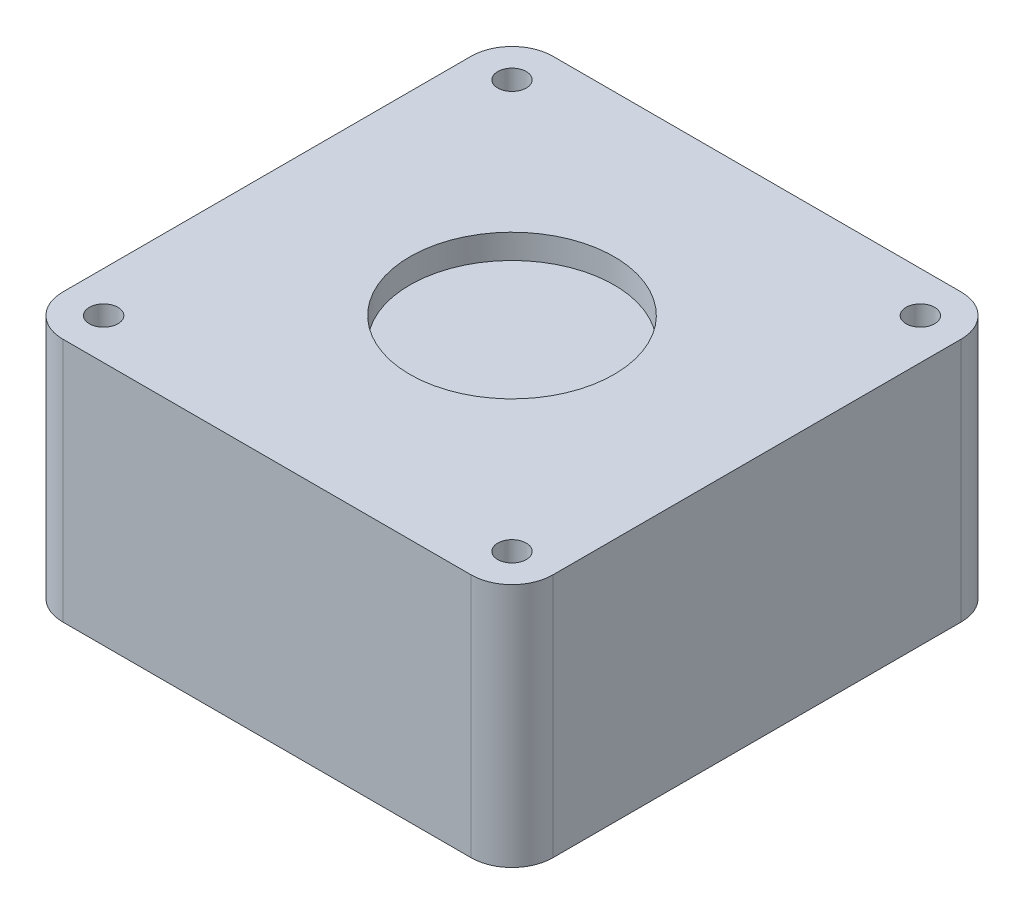
ISO-10303-21;
HEADER;
FILE_DESCRIPTION(('STEP AP214'),'2;1');
FILE_NAME('part.step','',(''),(''),'','','');
FILE_SCHEMA(('AUTOMOTIVE_DESIGN { 1 0 10303 214 1 1 1 1 }'));
ENDSEC;
DATA;
#1=APPLICATION_CONTEXT('core data for automotive mechanical design processes');
#2=APPLICATION_PROTOCOL_DEFINITION('international standard','automotive_design',2000,#1);
#3=PRODUCT_CONTEXT('',#1,'mechanical');
#4=PRODUCT('Part','Part','',(#3));
#5=PRODUCT_RELATED_PRODUCT_CATEGORY('part','',(#4));
#6=PRODUCT_DEFINITION_FORMATION('','',#4);
#7=PRODUCT_DEFINITION_CONTEXT('part definition',#1,'design');
#8=PRODUCT_DEFINITION('design','',#6,#7);
#9=PRODUCT_DEFINITION_SHAPE('','',#8);
#10=(LENGTH_UNIT() NAMED_UNIT(*) SI_UNIT(.MILLI.,.METRE.));
#11=(NAMED_UNIT(*) PLANE_ANGLE_UNIT() SI_UNIT($,.RADIAN.));
#12=(NAMED_UNIT(*) SI_UNIT($,.STERADIAN.) SOLID_ANGLE_UNIT());
#13=UNCERTAINTY_MEASURE_WITH_UNIT(LENGTH_MEASURE(1.E-05),#10,'distance_accuracy_value','');
#14=(GEOMETRIC_REPRESENTATION_CONTEXT(3) GLOBAL_UNCERTAINTY_ASSIGNED_CONTEXT((#13)) GLOBAL_UNIT_ASSIGNED_CONTEXT((#10,
#11,#12)) REPRESENTATION_CONTEXT('',''));
#15=CARTESIAN_POINT('',(0.,0.,0.));
#16=DIRECTION('',(0.,0.,1.));
#17=DIRECTION('',(1.,0.,0.));
#18=AXIS2_PLACEMENT_3D('',#15,#16,#17);
#19=CARTESIAN_POINT('',(30.,30.,30.));
#20=DIRECTION('',(-1.,0.,0.));
#21=DIRECTION('',(0.,0.,1.));
#22=AXIS2_PLACEMENT_3D('',#19,#20,#21);
#23=PLANE('',#22);
#24=DIRECTION('',(0.,0.,-1.));
#25=VECTOR('',#24,1.);
#26=CARTESIAN_POINT('',(30.,0.,30.));
#27=LINE('',#26,#25);
#28=CARTESIAN_POINT('',(30.,0.,25.));
#29=VERTEX_POINT('',#28);
#30=CARTESIAN_POINT('',(30.,0.,-25.));
#31=VERTEX_POINT('',#30);
#32=EDGE_CURVE('E194',#29,#31,#27,.T.);
#33=ORIENTED_EDGE('',*,*,#32,.T.);
#34=DIRECTION('',(0.,-1.,0.));
#35=VECTOR('',#34,1.);
#36=CARTESIAN_POINT('',(30.,30.,-25.));
#37=LINE('',#36,#35);
#38=CARTESIAN_POINT('',(30.,30.,-25.));
#39=VERTEX_POINT('',#38);
#40=EDGE_CURVE('E245',#31,#39,#37,.F.);
#41=ORIENTED_EDGE('',*,*,#40,.T.);
#42=DIRECTION('',(0.,0.,-1.));
#43=VECTOR('',#42,1.);
#44=CARTESIAN_POINT('',(30.,30.,30.));
#45=LINE('',#44,#43);
#46=CARTESIAN_POINT('',(30.,30.,25.));
#47=VERTEX_POINT('',#46);
#48=EDGE_CURVE('E197',#47,#39,#45,.T.);
#49=ORIENTED_EDGE('',*,*,#48,.F.);
#50=DIRECTION('',(0.,-1.,0.));
#51=VECTOR('',#50,1.);
#52=CARTESIAN_POINT('',(30.,30.,25.));
#53=LINE('',#52,#51);
#54=EDGE_CURVE('E242',#47,#29,#53,.T.);
#55=ORIENTED_EDGE('',*,*,#54,.T.);
#56=EDGE_LOOP('',(#33,#41,#49,#55));
#57=FACE_BOUND('',#56,.T.);
#58=ADVANCED_FACE('F35',(#57),#23,.F.);
#59=CARTESIAN_POINT('',(-30.,30.,-30.));
#60=DIRECTION('',(0.,0.,1.));
#61=DIRECTION('',(1.,0.,0.));
#62=AXIS2_PLACEMENT_3D('',#59,#60,#61);
#63=PLANE('',#62);
#64=DIRECTION('',(-1.,0.,0.));
#65=VECTOR('',#64,1.);
#66=CARTESIAN_POINT('',(-30.,0.,-30.));
#67=LINE('',#66,#65);
#68=CARTESIAN_POINT('',(25.,0.,-30.));
#69=VERTEX_POINT('',#68);
#70=CARTESIAN_POINT('',(-25.,0.,-30.));
#71=VERTEX_POINT('',#70);
#72=EDGE_CURVE('E211',#69,#71,#67,.T.);
#73=ORIENTED_EDGE('',*,*,#72,.T.);
#74=DIRECTION('',(0.,-1.,0.));
#75=VECTOR('',#74,1.);
#76=CARTESIAN_POINT('',(-25.,30.,-30.));
#77=LINE('',#76,#75);
#78=CARTESIAN_POINT('',(-25.,30.,-30.));
#79=VERTEX_POINT('',#78);
#80=EDGE_CURVE('E233',#71,#79,#77,.F.);
#81=ORIENTED_EDGE('',*,*,#80,.T.);
#82=DIRECTION('',(-1.,0.,0.));
#83=VECTOR('',#82,1.);
#84=CARTESIAN_POINT('',(-30.,30.,-30.));
#85=LINE('',#84,#83);
#86=CARTESIAN_POINT('',(25.,30.,-30.));
#87=VERTEX_POINT('',#86);
#88=EDGE_CURVE('E200',#87,#79,#85,.T.);
#89=ORIENTED_EDGE('',*,*,#88,.F.);
#90=DIRECTION('',(0.,-1.,0.));
#91=VECTOR('',#90,1.);
#92=CARTESIAN_POINT('',(25.,30.,-30.));
#93=LINE('',#92,#91);
#94=EDGE_CURVE('E230',#87,#69,#93,.T.);
#95=ORIENTED_EDGE('',*,*,#94,.T.);
#96=EDGE_LOOP('',(#73,#81,#89,#95));
#97=FACE_BOUND('',#96,.T.);
#98=ADVANCED_FACE('F270',(#97),#63,.F.);
#99=CARTESIAN_POINT('',(-30.,30.,30.));
#100=DIRECTION('',(1.,0.,0.));
#101=DIRECTION('',(0.,0.,-1.));
#102=AXIS2_PLACEMENT_3D('',#99,#100,#101);
#103=PLANE('',#102);
#104=DIRECTION('',(0.,0.,1.));
#105=VECTOR('',#104,1.);
#106=CARTESIAN_POINT('',(-30.,30.,30.));
#107=LINE('',#106,#105);
#108=CARTESIAN_POINT('',(-30.,30.,-25.));
#109=VERTEX_POINT('',#108);
#110=CARTESIAN_POINT('',(-30.,30.,25.));
#111=VERTEX_POINT('',#110);
#112=EDGE_CURVE('E204',#109,#111,#107,.T.);
#113=ORIENTED_EDGE('',*,*,#112,.F.);
#114=DIRECTION('',(0.,-1.,0.));
#115=VECTOR('',#114,1.);
#116=CARTESIAN_POINT('',(-30.,30.,-25.));
#117=LINE('',#116,#115);
#118=CARTESIAN_POINT('',(-30.,0.,-25.));
#119=VERTEX_POINT('',#118);
#120=EDGE_CURVE('E219',#109,#119,#117,.T.);
#121=ORIENTED_EDGE('',*,*,#120,.T.);
#122=DIRECTION('',(0.,0.,1.));
#123=VECTOR('',#122,1.);
#124=CARTESIAN_POINT('',(-30.,0.,30.));
#125=LINE('',#124,#123);
#126=CARTESIAN_POINT('',(-30.,0.,25.));
#127=VERTEX_POINT('',#126);
#128=EDGE_CURVE('E214',#119,#127,#125,.T.);
#129=ORIENTED_EDGE('',*,*,#128,.T.);
#130=DIRECTION('',(0.,-1.,0.));
#131=VECTOR('',#130,1.);
#132=CARTESIAN_POINT('',(-30.,30.,25.));
#133=LINE('',#132,#131);
#134=EDGE_CURVE('E208',#127,#111,#133,.F.);
#135=ORIENTED_EDGE('',*,*,#134,.T.);
#136=EDGE_LOOP('',(#113,#121,#129,#135));
#137=FACE_BOUND('',#136,.T.);
#138=ADVANCED_FACE('F278',(#137),#103,.F.);
#139=CARTESIAN_POINT('',(-30.,30.,30.));
#140=DIRECTION('',(0.,0.,-1.));
#141=DIRECTION('',(-1.,0.,0.));
#142=AXIS2_PLACEMENT_3D('',#139,#140,#141);
#143=PLANE('',#142);
#144=DIRECTION('',(1.,0.,0.));
#145=VECTOR('',#144,1.);
#146=CARTESIAN_POINT('',(-30.,0.,30.));
#147=LINE('',#146,#145);
#148=CARTESIAN_POINT('',(-25.,0.,30.));
#149=VERTEX_POINT('',#148);
#150=CARTESIAN_POINT('',(25.,0.,30.));
#151=VERTEX_POINT('',#150);
#152=EDGE_CURVE('E201',#149,#151,#147,.T.);
#153=ORIENTED_EDGE('',*,*,#152,.T.);
#154=DIRECTION('',(0.,-1.,0.));
#155=VECTOR('',#154,1.);
#156=CARTESIAN_POINT('',(25.,30.,30.));
#157=LINE('',#156,#155);
#158=CARTESIAN_POINT('',(25.,30.,30.));
#159=VERTEX_POINT('',#158);
#160=EDGE_CURVE('E11',#151,#159,#157,.F.);
#161=ORIENTED_EDGE('',*,*,#160,.T.);
#162=DIRECTION('',(1.,0.,0.));
#163=VECTOR('',#162,1.);
#164=CARTESIAN_POINT('',(-30.,30.,30.));
#165=LINE('',#164,#163);
#166=CARTESIAN_POINT('',(-25.,30.,30.));
#167=VERTEX_POINT('',#166);
#168=EDGE_CURVE('E206',#167,#159,#165,.T.);
#169=ORIENTED_EDGE('',*,*,#168,.F.);
#170=DIRECTION('',(0.,-1.,0.));
#171=VECTOR('',#170,1.);
#172=CARTESIAN_POINT('',(-25.,30.,30.));
#173=LINE('',#172,#171);
#174=EDGE_CURVE('E43',#167,#149,#173,.T.);
#175=ORIENTED_EDGE('',*,*,#174,.T.);
#176=EDGE_LOOP('',(#153,#161,#169,#175));
#177=FACE_BOUND('',#176,.T.);
#178=ADVANCED_FACE('F249',(#177),#143,.F.);
#179=CARTESIAN_POINT('',(0.,30.,0.));
#180=DIRECTION('',(0.,-1.,0.));
#181=DIRECTION('',(0.,0.,-1.));
#182=AXIS2_PLACEMENT_3D('',#179,#180,#181);
#183=PLANE('',#182);
#184=CARTESIAN_POINT('',(0.,30.,0.));
#185=DIRECTION('',(0.,1.,0.));
#186=DIRECTION('',(0.,0.,1.));
#187=AXIS2_PLACEMENT_3D('',#184,#185,#186);
#188=CIRCLE('',#187,12.5);
#189=CARTESIAN_POINT('',(0.,30.,12.5));
#190=VERTEX_POINT('',#189);
#191=EDGE_CURVE('E163',#190,#190,#188,.T.);
#192=ORIENTED_EDGE('',*,*,#191,.F.);
#193=EDGE_LOOP('',(#192));
#194=FACE_BOUND('',#193,.T.);
#195=CARTESIAN_POINT('',(25.,30.,25.));
#196=DIRECTION('',(0.,1.,0.));
#197=DIRECTION('',(0.,0.,1.));
#198=AXIS2_PLACEMENT_3D('',#195,#196,#197);
#199=CIRCLE('',#198,1.75);
#200=CARTESIAN_POINT('',(25.,30.,26.75));
#201=VERTEX_POINT('',#200);
#202=EDGE_CURVE('E170',#201,#201,#199,.T.);
#203=ORIENTED_EDGE('',*,*,#202,.F.);
#204=EDGE_LOOP('',(#203));
#205=FACE_BOUND('',#204,.T.);
#206=CARTESIAN_POINT('',(-25.,30.,25.));
#207=DIRECTION('',(0.,1.,0.));
#208=DIRECTION('',(0.,0.,1.));
#209=AXIS2_PLACEMENT_3D('',#206,#207,#208);
#210=CIRCLE('',#209,1.75);
#211=CARTESIAN_POINT('',(-25.,30.,26.75));
#212=VERTEX_POINT('',#211);
#213=EDGE_CURVE('E176',#212,#212,#210,.T.);
#214=ORIENTED_EDGE('',*,*,#213,.F.);
#215=EDGE_LOOP('',(#214));
#216=FACE_BOUND('',#215,.T.);
#217=CARTESIAN_POINT('',(-25.,30.,-25.));
#218=DIRECTION('',(0.,1.,0.));
#219=DIRECTION('',(0.,0.,1.));
#220=AXIS2_PLACEMENT_3D('',#217,#218,#219);
#221=CIRCLE('',#220,1.75);
#222=CARTESIAN_POINT('',(-25.,30.,-23.25));
#223=VERTEX_POINT('',#222);
#224=EDGE_CURVE('E182',#223,#223,#221,.T.);
#225=ORIENTED_EDGE('',*,*,#224,.F.);
#226=EDGE_LOOP('',(#225));
#227=FACE_BOUND('',#226,.T.);
#228=CARTESIAN_POINT('',(25.,30.,-25.));
#229=DIRECTION('',(0.,1.,0.));
#230=DIRECTION('',(0.,0.,1.));
#231=AXIS2_PLACEMENT_3D('',#228,#229,#230);
#232=CIRCLE('',#231,1.75);
#233=CARTESIAN_POINT('',(25.,30.,-23.25));
#234=VERTEX_POINT('',#233);
#235=EDGE_CURVE('E188',#234,#234,#232,.T.);
#236=ORIENTED_EDGE('',*,*,#235,.F.);
#237=EDGE_LOOP('',(#236));
#238=FACE_BOUND('',#237,.T.);
#239=ORIENTED_EDGE('',*,*,#88,.T.);
#240=CARTESIAN_POINT('',(-25.,30.,-25.));
#241=DIRECTION('',(0.,-1.,0.));
#242=DIRECTION('',(0.,0.,-1.));
#243=AXIS2_PLACEMENT_3D('',#240,#241,#242);
#244=CIRCLE('',#243,5.);
#245=EDGE_CURVE('E240',#79,#109,#244,.F.);
#246=ORIENTED_EDGE('',*,*,#245,.T.);
#247=ORIENTED_EDGE('',*,*,#112,.T.);
#248=CARTESIAN_POINT('',(-25.,30.,25.));
#249=DIRECTION('',(0.,-1.,0.));
#250=DIRECTION('',(0.,0.,-1.));
#251=AXIS2_PLACEMENT_3D('',#248,#249,#250);
#252=CIRCLE('',#251,5.);
#253=EDGE_CURVE('E55',#111,#167,#252,.F.);
#254=ORIENTED_EDGE('',*,*,#253,.T.);
#255=ORIENTED_EDGE('',*,*,#168,.T.);
#256=CARTESIAN_POINT('',(25.,30.,25.));
#257=DIRECTION('',(0.,-1.,0.));
#258=DIRECTION('',(0.,0.,-1.));
#259=AXIS2_PLACEMENT_3D('',#256,#257,#258);
#260=CIRCLE('',#259,5.);
#261=EDGE_CURVE('E236',#159,#47,#260,.F.);
#262=ORIENTED_EDGE('',*,*,#261,.T.);
#263=ORIENTED_EDGE('',*,*,#48,.T.);
#264=CARTESIAN_POINT('',(25.,30.,-25.));
#265=DIRECTION('',(0.,-1.,0.));
#266=DIRECTION('',(0.,0.,-1.));
#267=AXIS2_PLACEMENT_3D('',#264,#265,#266);
#268=CIRCLE('',#267,5.);
#269=EDGE_CURVE('E238',#39,#87,#268,.F.);
#270=ORIENTED_EDGE('',*,*,#269,.T.);
#271=EDGE_LOOP('',(#239,#246,#247,#254,#255,#262,#263,#270));
#272=FACE_BOUND('',#271,.T.);
#273=ADVANCED_FACE('F263',(#194,#205,#216,#227,#238,#272),#183,.F.);
#274=CARTESIAN_POINT('',(0.,0.,0.));
#275=DIRECTION('',(0.,-1.,0.));
#276=DIRECTION('',(0.,0.,-1.));
#277=AXIS2_PLACEMENT_3D('',#274,#275,#276);
#278=PLANE('',#277);
#279=DIRECTION('',(0.,0.,1.));
#280=VECTOR('',#279,1.);
#281=CARTESIAN_POINT('',(10.,0.,-10.));
#282=LINE('',#281,#280);
#283=CARTESIAN_POINT('',(10.,0.,-10.));
#284=VERTEX_POINT('',#283);
#285=CARTESIAN_POINT('',(10.,0.,10.));
#286=VERTEX_POINT('',#285);
#287=EDGE_CURVE('E131',#284,#286,#282,.T.);
#288=ORIENTED_EDGE('',*,*,#287,.F.);
#289=DIRECTION('',(1.,0.,0.));
#290=VECTOR('',#289,1.);
#291=CARTESIAN_POINT('',(-10.,0.,-10.));
#292=LINE('',#291,#290);
#293=CARTESIAN_POINT('',(-10.,0.,-10.));
#294=VERTEX_POINT('',#293);
#295=EDGE_CURVE('E148',#294,#284,#292,.T.);
#296=ORIENTED_EDGE('',*,*,#295,.F.);
#297=DIRECTION('',(0.,0.,-1.));
#298=VECTOR('',#297,1.);
#299=CARTESIAN_POINT('',(-10.,0.,-10.));
#300=LINE('',#299,#298);
#301=CARTESIAN_POINT('',(-10.,0.,10.));
#302=VERTEX_POINT('',#301);
#303=EDGE_CURVE('E151',#302,#294,#300,.T.);
#304=ORIENTED_EDGE('',*,*,#303,.F.);
#305=DIRECTION('',(-1.,0.,0.));
#306=VECTOR('',#305,1.);
#307=CARTESIAN_POINT('',(-10.,0.,10.));
#308=LINE('',#307,#306);
#309=EDGE_CURVE('E157',#286,#302,#308,.T.);
#310=ORIENTED_EDGE('',*,*,#309,.F.);
#311=EDGE_LOOP('',(#288,#296,#304,#310));
#312=FACE_BOUND('',#311,.T.);
#313=CARTESIAN_POINT('',(25.,0.,25.));
#314=DIRECTION('',(0.,1.,0.));
#315=DIRECTION('',(0.,0.,1.));
#316=AXIS2_PLACEMENT_3D('',#313,#314,#315);
#317=CIRCLE('',#316,1.75);
#318=CARTESIAN_POINT('',(25.,0.,26.75));
#319=VERTEX_POINT('',#318);
#320=EDGE_CURVE('E173',#319,#319,#317,.T.);
#321=ORIENTED_EDGE('',*,*,#320,.T.);
#322=EDGE_LOOP('',(#321));
#323=FACE_BOUND('',#322,.T.);
#324=CARTESIAN_POINT('',(-25.,0.,25.));
#325=DIRECTION('',(0.,1.,0.));
#326=DIRECTION('',(0.,0.,1.));
#327=AXIS2_PLACEMENT_3D('',#324,#325,#326);
#328=CIRCLE('',#327,1.75);
#329=CARTESIAN_POINT('',(-25.,0.,26.75));
#330=VERTEX_POINT('',#329);
#331=EDGE_CURVE('E179',#330,#330,#328,.T.);
#332=ORIENTED_EDGE('',*,*,#331,.T.);
#333=EDGE_LOOP('',(#332));
#334=FACE_BOUND('',#333,.T.);
#335=CARTESIAN_POINT('',(-25.,0.,-25.));
#336=DIRECTION('',(0.,1.,0.));
#337=DIRECTION('',(0.,0.,1.));
#338=AXIS2_PLACEMENT_3D('',#335,#336,#337);
#339=CIRCLE('',#338,1.75);
#340=CARTESIAN_POINT('',(-25.,0.,-23.25));
#341=VERTEX_POINT('',#340);
#342=EDGE_CURVE('E185',#341,#341,#339,.T.);
#343=ORIENTED_EDGE('',*,*,#342,.T.);
#344=EDGE_LOOP('',(#343));
#345=FACE_BOUND('',#344,.T.);
#346=CARTESIAN_POINT('',(25.,0.,-25.));
#347=DIRECTION('',(0.,1.,0.));
#348=DIRECTION('',(0.,0.,1.));
#349=AXIS2_PLACEMENT_3D('',#346,#347,#348);
#350=CIRCLE('',#349,1.75);
#351=CARTESIAN_POINT('',(25.,0.,-23.25));
#352=VERTEX_POINT('',#351);
#353=EDGE_CURVE('E191',#352,#352,#350,.T.);
#354=ORIENTED_EDGE('',*,*,#353,.T.);
#355=EDGE_LOOP('',(#354));
#356=FACE_BOUND('',#355,.T.);
#357=ORIENTED_EDGE('',*,*,#128,.F.);
#358=CARTESIAN_POINT('',(-25.,0.,-25.));
#359=DIRECTION('',(0.,-1.,0.));
#360=DIRECTION('',(0.,0.,-1.));
#361=AXIS2_PLACEMENT_3D('',#358,#359,#360);
#362=CIRCLE('',#361,5.);
#363=EDGE_CURVE('E228',#119,#71,#362,.T.);
#364=ORIENTED_EDGE('',*,*,#363,.T.);
#365=ORIENTED_EDGE('',*,*,#72,.F.);
#366=CARTESIAN_POINT('',(25.,0.,-25.));
#367=DIRECTION('',(0.,-1.,0.));
#368=DIRECTION('',(0.,0.,-1.));
#369=AXIS2_PLACEMENT_3D('',#366,#367,#368);
#370=CIRCLE('',#369,5.);
#371=EDGE_CURVE('E226',#69,#31,#370,.T.);
#372=ORIENTED_EDGE('',*,*,#371,.T.);
#373=ORIENTED_EDGE('',*,*,#32,.F.);
#374=CARTESIAN_POINT('',(25.,0.,25.));
#375=DIRECTION('',(0.,-1.,0.));
#376=DIRECTION('',(0.,0.,-1.));
#377=AXIS2_PLACEMENT_3D('',#374,#375,#376);
#378=CIRCLE('',#377,5.);
#379=EDGE_CURVE('E224',#29,#151,#378,.T.);
#380=ORIENTED_EDGE('',*,*,#379,.T.);
#381=ORIENTED_EDGE('',*,*,#152,.F.);
#382=CARTESIAN_POINT('',(-25.,0.,25.));
#383=DIRECTION('',(0.,-1.,0.));
#384=DIRECTION('',(0.,0.,-1.));
#385=AXIS2_PLACEMENT_3D('',#382,#383,#384);
#386=CIRCLE('',#385,5.);
#387=EDGE_CURVE('E222',#149,#127,#386,.T.);
#388=ORIENTED_EDGE('',*,*,#387,.T.);
#389=EDGE_LOOP('',(#357,#364,#365,#372,#373,#380,#381,#388));
#390=FACE_BOUND('',#389,.T.);
#391=ADVANCED_FACE('F253',(#312,#323,#334,#345,#356,#390),#278,.T.);
#392=CARTESIAN_POINT('',(25.,0.,-25.));
#393=DIRECTION('',(0.,1.,0.));
#394=DIRECTION('',(0.,0.,1.));
#395=AXIS2_PLACEMENT_3D('',#392,#393,#394);
#396=CYLINDRICAL_SURFACE('',#395,1.75);
#397=ORIENTED_EDGE('',*,*,#353,.F.);
#398=EDGE_LOOP('',(#397));
#399=FACE_BOUND('',#398,.T.);
#400=ORIENTED_EDGE('',*,*,#235,.T.);
#401=EDGE_LOOP('',(#400));
#402=FACE_BOUND('',#401,.T.);
#403=ADVANCED_FACE('F417',(#399,#402),#396,.F.);
#404=CARTESIAN_POINT('',(-25.,0.,-25.));
#405=DIRECTION('',(0.,1.,0.));
#406=DIRECTION('',(0.,0.,1.));
#407=AXIS2_PLACEMENT_3D('',#404,#405,#406);
#408=CYLINDRICAL_SURFACE('',#407,1.75);
#409=ORIENTED_EDGE('',*,*,#342,.F.);
#410=EDGE_LOOP('',(#409));
#411=FACE_BOUND('',#410,.T.);
#412=ORIENTED_EDGE('',*,*,#224,.T.);
#413=EDGE_LOOP('',(#412));
#414=FACE_BOUND('',#413,.T.);
#415=ADVANCED_FACE('F407',(#411,#414),#408,.F.);
#416=CARTESIAN_POINT('',(-25.,0.,25.));
#417=DIRECTION('',(0.,1.,0.));
#418=DIRECTION('',(0.,0.,1.));
#419=AXIS2_PLACEMENT_3D('',#416,#417,#418);
#420=CYLINDRICAL_SURFACE('',#419,1.75);
#421=ORIENTED_EDGE('',*,*,#331,.F.);
#422=EDGE_LOOP('',(#421));
#423=FACE_BOUND('',#422,.T.);
#424=ORIENTED_EDGE('',*,*,#213,.T.);
#425=EDGE_LOOP('',(#424));
#426=FACE_BOUND('',#425,.T.);
#427=ADVANCED_FACE('F397',(#423,#426),#420,.F.);
#428=CARTESIAN_POINT('',(25.,0.,25.));
#429=DIRECTION('',(0.,1.,0.));
#430=DIRECTION('',(0.,0.,1.));
#431=AXIS2_PLACEMENT_3D('',#428,#429,#430);
#432=CYLINDRICAL_SURFACE('',#431,1.75);
#433=ORIENTED_EDGE('',*,*,#320,.F.);
#434=EDGE_LOOP('',(#433));
#435=FACE_BOUND('',#434,.T.);
#436=ORIENTED_EDGE('',*,*,#202,.T.);
#437=EDGE_LOOP('',(#436));
#438=FACE_BOUND('',#437,.T.);
#439=ADVANCED_FACE('F387',(#435,#438),#432,.F.);
#440=CARTESIAN_POINT('',(0.,27.,0.));
#441=DIRECTION('',(0.,1.,0.));
#442=DIRECTION('',(0.,0.,1.));
#443=AXIS2_PLACEMENT_3D('',#440,#441,#442);
#444=CYLINDRICAL_SURFACE('',#443,12.5);
#445=CARTESIAN_POINT('',(0.,27.,0.));
#446=DIRECTION('',(0.,1.,0.));
#447=DIRECTION('',(0.,0.,1.));
#448=AXIS2_PLACEMENT_3D('',#445,#446,#447);
#449=CIRCLE('',#448,12.5);
#450=CARTESIAN_POINT('',(0.,27.,12.5));
#451=VERTEX_POINT('',#450);
#452=EDGE_CURVE('E167',#451,#451,#449,.T.);
#453=ORIENTED_EDGE('',*,*,#452,.F.);
#454=EDGE_LOOP('',(#453));
#455=FACE_BOUND('',#454,.T.);
#456=ORIENTED_EDGE('',*,*,#191,.T.);
#457=EDGE_LOOP('',(#456));
#458=FACE_BOUND('',#457,.T.);
#459=ADVANCED_FACE('F377',(#455,#458),#444,.F.);
#460=CARTESIAN_POINT('',(0.,27.,0.));
#461=DIRECTION('',(0.,1.,0.));
#462=DIRECTION('',(0.,0.,1.));
#463=AXIS2_PLACEMENT_3D('',#460,#461,#462);
#464=PLANE('',#463);
#465=ORIENTED_EDGE('',*,*,#452,.T.);
#466=EDGE_LOOP('',(#465));
#467=FACE_BOUND('',#466,.T.);
#468=ADVANCED_FACE('F368',(#467),#464,.T.);
#469=CARTESIAN_POINT('',(10.,3.,-10.));
#470=DIRECTION('',(1.,0.,0.));
#471=DIRECTION('',(0.,0.,-1.));
#472=AXIS2_PLACEMENT_3D('',#469,#470,#471);
#473=PLANE('',#472);
#474=ORIENTED_EDGE('',*,*,#287,.T.);
#475=DIRECTION('',(0.,-1.,0.));
#476=VECTOR('',#475,1.);
#477=CARTESIAN_POINT('',(10.,3.,10.));
#478=LINE('',#477,#476);
#479=CARTESIAN_POINT('',(10.,3.,10.));
#480=VERTEX_POINT('',#479);
#481=EDGE_CURVE('E124',#480,#286,#478,.T.);
#482=ORIENTED_EDGE('',*,*,#481,.F.);
#483=DIRECTION('',(0.,0.,1.));
#484=VECTOR('',#483,1.);
#485=CARTESIAN_POINT('',(10.,3.,-10.));
#486=LINE('',#485,#484);
#487=CARTESIAN_POINT('',(10.,3.,-10.));
#488=VERTEX_POINT('',#487);
#489=EDGE_CURVE('E128',#488,#480,#486,.T.);
#490=ORIENTED_EDGE('',*,*,#489,.F.);
#491=DIRECTION('',(0.,-1.,0.));
#492=VECTOR('',#491,1.);
#493=CARTESIAN_POINT('',(10.,3.,-10.));
#494=LINE('',#493,#492);
#495=EDGE_CURVE('E161',#488,#284,#494,.T.);
#496=ORIENTED_EDGE('',*,*,#495,.T.);
#497=EDGE_LOOP('',(#474,#482,#490,#496));
#498=FACE_BOUND('',#497,.T.);
#499=ADVANCED_FACE('F126',(#498),#473,.F.);
#500=CARTESIAN_POINT('',(-10.,3.,-10.));
#501=DIRECTION('',(0.,0.,-1.));
#502=DIRECTION('',(-1.,0.,0.));
#503=AXIS2_PLACEMENT_3D('',#500,#501,#502);
#504=PLANE('',#503);
#505=ORIENTED_EDGE('',*,*,#295,.T.);
#506=ORIENTED_EDGE('',*,*,#495,.F.);
#507=DIRECTION('',(1.,0.,0.));
#508=VECTOR('',#507,1.);
#509=CARTESIAN_POINT('',(-10.,3.,-10.));
#510=LINE('',#509,#508);
#511=CARTESIAN_POINT('',(-10.,3.,-10.));
#512=VERTEX_POINT('',#511);
#513=EDGE_CURVE('E136',#512,#488,#510,.T.);
#514=ORIENTED_EDGE('',*,*,#513,.F.);
#515=DIRECTION('',(0.,-1.,0.));
#516=VECTOR('',#515,1.);
#517=CARTESIAN_POINT('',(-10.,3.,-10.));
#518=LINE('',#517,#516);
#519=EDGE_CURVE('E164',#512,#294,#518,.T.);
#520=ORIENTED_EDGE('',*,*,#519,.T.);
#521=EDGE_LOOP('',(#505,#506,#514,#520));
#522=FACE_BOUND('',#521,.T.);
#523=ADVANCED_FACE('F349',(#522),#504,.F.);
#524=CARTESIAN_POINT('',(-10.,3.,-10.));
#525=DIRECTION('',(-1.,0.,0.));
#526=DIRECTION('',(0.,0.,1.));
#527=AXIS2_PLACEMENT_3D('',#524,#525,#526);
#528=PLANE('',#527);
#529=ORIENTED_EDGE('',*,*,#303,.T.);
#530=ORIENTED_EDGE('',*,*,#519,.F.);
#531=DIRECTION('',(0.,0.,-1.));
#532=VECTOR('',#531,1.);
#533=CARTESIAN_POINT('',(-10.,3.,-10.));
#534=LINE('',#533,#532);
#535=CARTESIAN_POINT('',(-10.,3.,10.));
#536=VERTEX_POINT('',#535);
#537=EDGE_CURVE('E144',#536,#512,#534,.T.);
#538=ORIENTED_EDGE('',*,*,#537,.F.);
#539=DIRECTION('',(0.,-1.,0.));
#540=VECTOR('',#539,1.);
#541=CARTESIAN_POINT('',(-10.,3.,10.));
#542=LINE('',#541,#540);
#543=EDGE_CURVE('E135',#536,#302,#542,.T.);
#544=ORIENTED_EDGE('',*,*,#543,.T.);
#545=EDGE_LOOP('',(#529,#530,#538,#544));
#546=FACE_BOUND('',#545,.T.);
#547=ADVANCED_FACE('F340',(#546),#528,.F.);
#548=CARTESIAN_POINT('',(-10.,3.,10.));
#549=DIRECTION('',(0.,0.,1.));
#550=DIRECTION('',(1.,0.,0.));
#551=AXIS2_PLACEMENT_3D('',#548,#549,#550);
#552=PLANE('',#551);
#553=ORIENTED_EDGE('',*,*,#309,.T.);
#554=ORIENTED_EDGE('',*,*,#543,.F.);
#555=DIRECTION('',(-1.,0.,0.));
#556=VECTOR('',#555,1.);
#557=CARTESIAN_POINT('',(-10.,3.,10.));
#558=LINE('',#557,#556);
#559=EDGE_CURVE('E139',#480,#536,#558,.T.);
#560=ORIENTED_EDGE('',*,*,#559,.F.);
#561=ORIENTED_EDGE('',*,*,#481,.T.);
#562=EDGE_LOOP('',(#553,#554,#560,#561));
#563=FACE_BOUND('',#562,.T.);
#564=ADVANCED_FACE('F140',(#563),#552,.F.);
#565=CARTESIAN_POINT('',(0.,3.,0.));
#566=DIRECTION('',(0.,1.,0.));
#567=DIRECTION('',(0.,0.,1.));
#568=AXIS2_PLACEMENT_3D('',#565,#566,#567);
#569=PLANE('',#568);
#570=ORIENTED_EDGE('',*,*,#489,.T.);
#571=ORIENTED_EDGE('',*,*,#559,.T.);
#572=ORIENTED_EDGE('',*,*,#537,.T.);
#573=ORIENTED_EDGE('',*,*,#513,.T.);
#574=EDGE_LOOP('',(#570,#571,#572,#573));
#575=FACE_BOUND('',#574,.T.);
#576=ADVANCED_FACE('F146',(#575),#569,.F.);
#577=CARTESIAN_POINT('',(-25.,30.,-25.));
#578=DIRECTION('',(0.,-1.,0.));
#579=DIRECTION('',(0.,0.,-1.));
#580=AXIS2_PLACEMENT_3D('',#577,#578,#579);
#581=CYLINDRICAL_SURFACE('',#580,5.);
#582=ORIENTED_EDGE('',*,*,#245,.F.);
#583=ORIENTED_EDGE('',*,*,#80,.F.);
#584=ORIENTED_EDGE('',*,*,#363,.F.);
#585=ORIENTED_EDGE('',*,*,#120,.F.);
#586=EDGE_LOOP('',(#582,#583,#584,#585));
#587=FACE_BOUND('',#586,.T.);
#588=ADVANCED_FACE('F275',(#587),#581,.T.);
#589=CARTESIAN_POINT('',(25.,30.,-25.));
#590=DIRECTION('',(0.,-1.,0.));
#591=DIRECTION('',(0.,0.,-1.));
#592=AXIS2_PLACEMENT_3D('',#589,#590,#591);
#593=CYLINDRICAL_SURFACE('',#592,5.);
#594=ORIENTED_EDGE('',*,*,#269,.F.);
#595=ORIENTED_EDGE('',*,*,#40,.F.);
#596=ORIENTED_EDGE('',*,*,#371,.F.);
#597=ORIENTED_EDGE('',*,*,#94,.F.);
#598=EDGE_LOOP('',(#594,#595,#596,#597));
#599=FACE_BOUND('',#598,.T.);
#600=ADVANCED_FACE('F267',(#599),#593,.T.);
#601=CARTESIAN_POINT('',(25.,30.,25.));
#602=DIRECTION('',(0.,-1.,0.));
#603=DIRECTION('',(0.,0.,-1.));
#604=AXIS2_PLACEMENT_3D('',#601,#602,#603);
#605=CYLINDRICAL_SURFACE('',#604,5.);
#606=ORIENTED_EDGE('',*,*,#261,.F.);
#607=ORIENTED_EDGE('',*,*,#160,.F.);
#608=ORIENTED_EDGE('',*,*,#379,.F.);
#609=ORIENTED_EDGE('',*,*,#54,.F.);
#610=EDGE_LOOP('',(#606,#607,#608,#609));
#611=FACE_BOUND('',#610,.T.);
#612=ADVANCED_FACE('F258',(#611),#605,.T.);
#613=CARTESIAN_POINT('',(-25.,30.,25.));
#614=DIRECTION('',(0.,-1.,0.));
#615=DIRECTION('',(0.,0.,-1.));
#616=AXIS2_PLACEMENT_3D('',#613,#614,#615);
#617=CYLINDRICAL_SURFACE('',#616,5.);
#618=ORIENTED_EDGE('',*,*,#253,.F.);
#619=ORIENTED_EDGE('',*,*,#134,.F.);
#620=ORIENTED_EDGE('',*,*,#387,.F.);
#621=ORIENTED_EDGE('',*,*,#174,.F.);
#622=EDGE_LOOP('',(#618,#619,#620,#621));
#623=FACE_BOUND('',#622,.T.);
#624=ADVANCED_FACE('F37',(#623),#617,.T.);
#625=CLOSED_SHELL('',(#58,#98,#138,#178,#273,#391,#403,#415,#427,#439,#459,#468,#499,#523,#547,
#564,#576,#588,#600,#612,#624));
#626=MANIFOLD_SOLID_BREP('B2',#625);
#627=ADVANCED_BREP_SHAPE_REPRESENTATION('',(#18,#626),#14);
#628=SHAPE_DEFINITION_REPRESENTATION(#9,#627);
ENDSEC;
END-ISO-10303-21;
